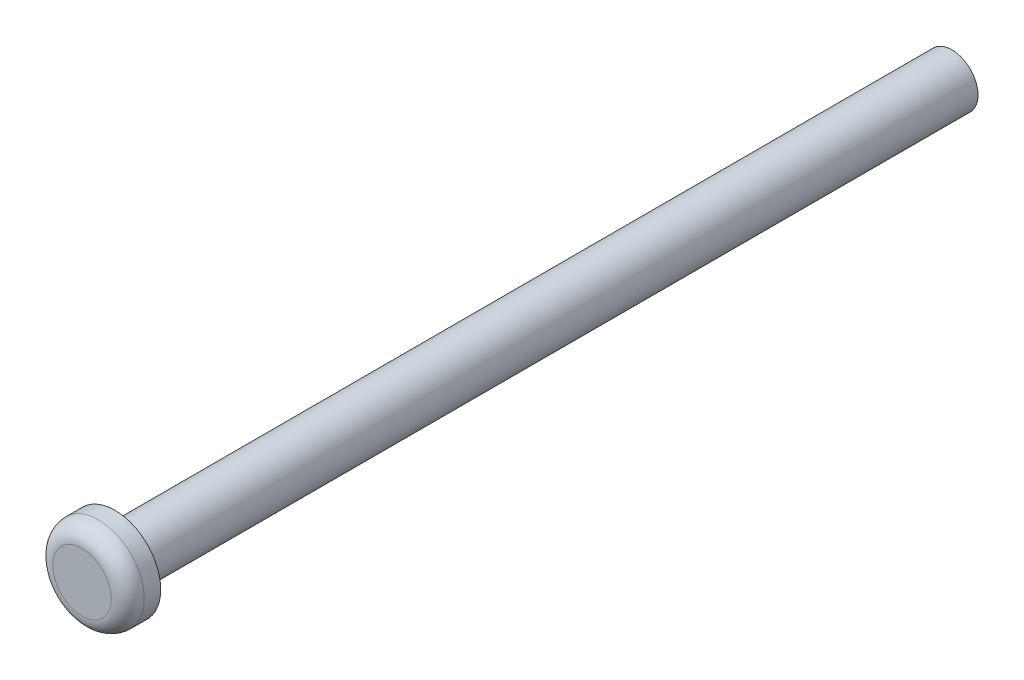
ISO-10303-21;
HEADER;
FILE_DESCRIPTION(('STEP AP214'),'2;1');
FILE_NAME('part.step','',(''),(''),'','','');
FILE_SCHEMA(('AUTOMOTIVE_DESIGN { 1 0 10303 214 1 1 1 1 }'));
ENDSEC;
DATA;
#1=APPLICATION_CONTEXT('core data for automotive mechanical design processes');
#2=APPLICATION_PROTOCOL_DEFINITION('international standard','automotive_design',2000,#1);
#3=PRODUCT_CONTEXT('',#1,'mechanical');
#4=PRODUCT('Part','Part','',(#3));
#5=PRODUCT_RELATED_PRODUCT_CATEGORY('part','',(#4));
#6=PRODUCT_DEFINITION_FORMATION('','',#4);
#7=PRODUCT_DEFINITION_CONTEXT('part definition',#1,'design');
#8=PRODUCT_DEFINITION('design','',#6,#7);
#9=PRODUCT_DEFINITION_SHAPE('','',#8);
#10=(LENGTH_UNIT() NAMED_UNIT(*) SI_UNIT(.MILLI.,.METRE.));
#11=(NAMED_UNIT(*) PLANE_ANGLE_UNIT() SI_UNIT($,.RADIAN.));
#12=(NAMED_UNIT(*) SI_UNIT($,.STERADIAN.) SOLID_ANGLE_UNIT());
#13=UNCERTAINTY_MEASURE_WITH_UNIT(LENGTH_MEASURE(1.E-05),#10,'distance_accuracy_value','');
#14=(GEOMETRIC_REPRESENTATION_CONTEXT(3) GLOBAL_UNCERTAINTY_ASSIGNED_CONTEXT((#13)) GLOBAL_UNIT_ASSIGNED_CONTEXT((#10,
#11,#12)) REPRESENTATION_CONTEXT('',''));
#15=CARTESIAN_POINT('',(0.,0.,0.));
#16=DIRECTION('',(0.,0.,1.));
#17=DIRECTION('',(1.,0.,0.));
#18=AXIS2_PLACEMENT_3D('',#15,#16,#17);
#19=CARTESIAN_POINT('',(0.,0.,-101.6));
#20=DIRECTION('',(0.,0.,1.));
#21=DIRECTION('',(1.,0.,0.));
#22=AXIS2_PLACEMENT_3D('',#19,#20,#21);
#23=CYLINDRICAL_SURFACE('',#22,3.175);
#24=CARTESIAN_POINT('',(0.,0.,-101.6));
#25=DIRECTION('',(0.,0.,1.));
#26=DIRECTION('',(1.,0.,0.));
#27=AXIS2_PLACEMENT_3D('',#24,#25,#26);
#28=CIRCLE('',#27,3.175);
#29=CARTESIAN_POINT('',(3.175,0.,-101.6));
#30=VERTEX_POINT('',#29);
#31=EDGE_CURVE('E42',#30,#30,#28,.T.);
#32=ORIENTED_EDGE('',*,*,#31,.T.);
#33=EDGE_LOOP('',(#32));
#34=FACE_BOUND('',#33,.T.);
#35=CARTESIAN_POINT('',(0.,0.,0.));
#36=DIRECTION('',(0.,0.,1.));
#37=DIRECTION('',(1.,0.,0.));
#38=AXIS2_PLACEMENT_3D('',#35,#36,#37);
#39=CIRCLE('',#38,3.175);
#40=CARTESIAN_POINT('',(3.175,0.,0.));
#41=VERTEX_POINT('',#40);
#42=EDGE_CURVE('E46',#41,#41,#39,.T.);
#43=ORIENTED_EDGE('',*,*,#42,.F.);
#44=EDGE_LOOP('',(#43));
#45=FACE_BOUND('',#44,.T.);
#46=ADVANCED_FACE('F31',(#34,#45),#23,.T.);
#47=CARTESIAN_POINT('',(0.,0.,-101.6));
#48=DIRECTION('',(0.,0.,1.));
#49=DIRECTION('',(1.,0.,0.));
#50=AXIS2_PLACEMENT_3D('',#47,#48,#49);
#51=PLANE('',#50);
#52=ORIENTED_EDGE('',*,*,#31,.F.);
#53=EDGE_LOOP('',(#52));
#54=FACE_BOUND('',#53,.T.);
#55=ADVANCED_FACE('F70',(#54),#51,.F.);
#56=CARTESIAN_POINT('',(0.,0.,4.));
#57=DIRECTION('',(0.,0.,-1.));
#58=DIRECTION('',(-1.,0.,0.));
#59=AXIS2_PLACEMENT_3D('',#56,#57,#58);
#60=CYLINDRICAL_SURFACE('',#59,5.55625);
#61=CARTESIAN_POINT('',(0.,0.,2.));
#62=DIRECTION('',(0.,0.,1.));
#63=DIRECTION('',(1.,0.,0.));
#64=AXIS2_PLACEMENT_3D('',#61,#62,#63);
#65=CIRCLE('',#64,5.55625);
#66=CARTESIAN_POINT('',(5.55625,0.,2.));
#67=VERTEX_POINT('',#66);
#68=EDGE_CURVE('E10',#67,#67,#65,.F.);
#69=ORIENTED_EDGE('',*,*,#68,.T.);
#70=EDGE_LOOP('',(#69));
#71=FACE_BOUND('',#70,.T.);
#72=CARTESIAN_POINT('',(0.,0.,0.));
#73=DIRECTION('',(0.,0.,1.));
#74=DIRECTION('',(1.,0.,0.));
#75=AXIS2_PLACEMENT_3D('',#72,#73,#74);
#76=CIRCLE('',#75,5.55625);
#77=CARTESIAN_POINT('',(5.55625,0.,0.));
#78=VERTEX_POINT('',#77);
#79=EDGE_CURVE('E50',#78,#78,#76,.T.);
#80=ORIENTED_EDGE('',*,*,#79,.T.);
#81=EDGE_LOOP('',(#80));
#82=FACE_BOUND('',#81,.T.);
#83=ADVANCED_FACE('F55',(#71,#82),#60,.T.);
#84=CARTESIAN_POINT('',(0.,0.,4.));
#85=DIRECTION('',(0.,0.,1.));
#86=DIRECTION('',(1.,0.,0.));
#87=AXIS2_PLACEMENT_3D('',#84,#85,#86);
#88=PLANE('',#87);
#89=CARTESIAN_POINT('',(0.,0.,4.));
#90=DIRECTION('',(0.,0.,1.));
#91=DIRECTION('',(1.,0.,0.));
#92=AXIS2_PLACEMENT_3D('',#89,#90,#91);
#93=CIRCLE('',#92,3.55625);
#94=CARTESIAN_POINT('',(3.55625,0.,4.));
#95=VERTEX_POINT('',#94);
#96=EDGE_CURVE('E38',#95,#95,#93,.T.);
#97=ORIENTED_EDGE('',*,*,#96,.T.);
#98=EDGE_LOOP('',(#97));
#99=FACE_BOUND('',#98,.T.);
#100=ADVANCED_FACE('F59',(#99),#88,.T.);
#101=CARTESIAN_POINT('',(0.,0.,0.));
#102=DIRECTION('',(0.,0.,1.));
#103=DIRECTION('',(1.,0.,0.));
#104=AXIS2_PLACEMENT_3D('',#101,#102,#103);
#105=PLANE('',#104);
#106=ORIENTED_EDGE('',*,*,#42,.T.);
#107=EDGE_LOOP('',(#106));
#108=FACE_BOUND('',#107,.T.);
#109=ORIENTED_EDGE('',*,*,#79,.F.);
#110=EDGE_LOOP('',(#109));
#111=FACE_BOUND('',#110,.T.);
#112=ADVANCED_FACE('F57',(#108,#111),#105,.F.);
#113=CARTESIAN_POINT('',(0.,0.,2.));
#114=DIRECTION('',(0.,0.,1.));
#115=DIRECTION('',(1.,0.,0.));
#116=AXIS2_PLACEMENT_3D('',#113,#114,#115);
#117=TOROIDAL_SURFACE('',#116,3.55625,2.);
#118=ORIENTED_EDGE('',*,*,#68,.F.);
#119=EDGE_LOOP('',(#118));
#120=FACE_BOUND('',#119,.T.);
#121=ORIENTED_EDGE('',*,*,#96,.F.);
#122=EDGE_LOOP('',(#121));
#123=FACE_BOUND('',#122,.T.);
#124=ADVANCED_FACE('F33',(#120,#123),#117,.T.);
#125=CLOSED_SHELL('',(#46,#55,#83,#100,#112,#124));
#126=MANIFOLD_SOLID_BREP('B2',#125);
#127=ADVANCED_BREP_SHAPE_REPRESENTATION('',(#18,#126),#14);
#128=SHAPE_DEFINITION_REPRESENTATION(#9,#127);
ENDSEC;
END-ISO-10303-21;
